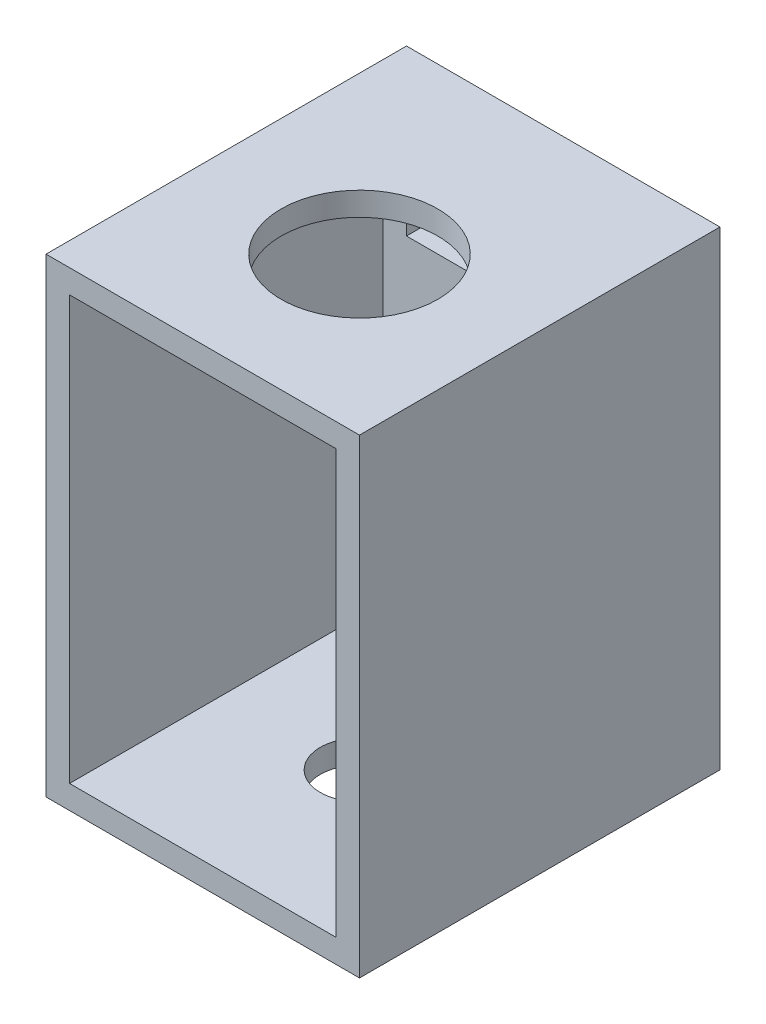
ISO-10303-21;
HEADER;
FILE_DESCRIPTION(('STEP AP214'),'2;1');
FILE_NAME('part.step','',(''),(''),'','','');
FILE_SCHEMA(('AUTOMOTIVE_DESIGN { 1 0 10303 214 1 1 1 1 }'));
ENDSEC;
DATA;
#1=APPLICATION_CONTEXT('core data for automotive mechanical design processes');
#2=APPLICATION_PROTOCOL_DEFINITION('international standard','automotive_design',2000,#1);
#3=PRODUCT_CONTEXT('',#1,'mechanical');
#4=PRODUCT('Part','Part','',(#3));
#5=PRODUCT_RELATED_PRODUCT_CATEGORY('part','',(#4));
#6=PRODUCT_DEFINITION_FORMATION('','',#4);
#7=PRODUCT_DEFINITION_CONTEXT('part definition',#1,'design');
#8=PRODUCT_DEFINITION('design','',#6,#7);
#9=PRODUCT_DEFINITION_SHAPE('','',#8);
#10=(LENGTH_UNIT() NAMED_UNIT(*) SI_UNIT(.MILLI.,.METRE.));
#11=(NAMED_UNIT(*) PLANE_ANGLE_UNIT() SI_UNIT($,.RADIAN.));
#12=(NAMED_UNIT(*) SI_UNIT($,.STERADIAN.) SOLID_ANGLE_UNIT());
#13=UNCERTAINTY_MEASURE_WITH_UNIT(LENGTH_MEASURE(1.E-05),#10,'distance_accuracy_value','');
#14=(GEOMETRIC_REPRESENTATION_CONTEXT(3) GLOBAL_UNCERTAINTY_ASSIGNED_CONTEXT((#13)) GLOBAL_UNIT_ASSIGNED_CONTEXT((#10,
#11,#12)) REPRESENTATION_CONTEXT('',''));
#15=CARTESIAN_POINT('',(0.,0.,0.));
#16=DIRECTION('',(0.,0.,1.));
#17=DIRECTION('',(1.,0.,0.));
#18=AXIS2_PLACEMENT_3D('',#15,#16,#17);
#19=CARTESIAN_POINT('',(0.,50.,-3.));
#20=DIRECTION('',(0.,-1.,0.));
#21=DIRECTION('',(0.,0.,-1.));
#22=AXIS2_PLACEMENT_3D('',#19,#20,#21);
#23=PLANE('',#22);
#24=DIRECTION('',(0.,0.,1.));
#25=VECTOR('',#24,1.);
#26=CARTESIAN_POINT('',(0.,50.,-3.));
#27=LINE('',#26,#25);
#28=CARTESIAN_POINT('',(0.,50.,-3.));
#29=VERTEX_POINT('',#28);
#30=CARTESIAN_POINT('',(0.,50.,20.));
#31=VERTEX_POINT('',#30);
#32=EDGE_CURVE('E146',#29,#31,#27,.T.);
#33=ORIENTED_EDGE('',*,*,#32,.T.);
#34=DIRECTION('',(1.,0.,0.));
#35=VECTOR('',#34,1.);
#36=CARTESIAN_POINT('',(0.,50.,20.));
#37=LINE('',#36,#35);
#38=CARTESIAN_POINT('',(20.,50.,20.));
#39=VERTEX_POINT('',#38);
#40=EDGE_CURVE('E155',#31,#39,#37,.T.);
#41=ORIENTED_EDGE('',*,*,#40,.T.);
#42=DIRECTION('',(0.,0.,1.));
#43=VECTOR('',#42,1.);
#44=CARTESIAN_POINT('',(20.,50.,-3.));
#45=LINE('',#44,#43);
#46=CARTESIAN_POINT('',(20.,50.,-3.));
#47=VERTEX_POINT('',#46);
#48=EDGE_CURVE('E136',#47,#39,#45,.T.);
#49=ORIENTED_EDGE('',*,*,#48,.F.);
#50=DIRECTION('',(1.,0.,0.));
#51=VECTOR('',#50,1.);
#52=CARTESIAN_POINT('',(0.,50.,-3.));
#53=LINE('',#52,#51);
#54=EDGE_CURVE('E244',#29,#47,#53,.T.);
#55=ORIENTED_EDGE('',*,*,#54,.F.);
#56=EDGE_LOOP('',(#33,#41,#49,#55));
#57=FACE_BOUND('',#56,.T.);
#58=CARTESIAN_POINT('',(9.99999999999999,50.,10.));
#59=DIRECTION('',(0.,1.,0.));
#60=DIRECTION('',(0.,0.,1.));
#61=AXIS2_PLACEMENT_3D('',#58,#59,#60);
#62=CIRCLE('',#61,5.);
#63=CARTESIAN_POINT('',(15.,50.,10.));
#64=VERTEX_POINT('',#63);
#65=EDGE_CURVE('E377',#64,#64,#62,.T.);
#66=ORIENTED_EDGE('',*,*,#65,.F.);
#67=EDGE_LOOP('',(#66));
#68=FACE_BOUND('',#67,.T.);
#69=ADVANCED_FACE('F45',(#57,#68),#23,.F.);
#70=CARTESIAN_POINT('',(0.,48.5,20.));
#71=DIRECTION('',(0.,1.,0.));
#72=DIRECTION('',(0.,0.,1.));
#73=AXIS2_PLACEMENT_3D('',#70,#71,#72);
#74=PLANE('',#73);
#75=DIRECTION('',(1.,0.,0.));
#76=VECTOR('',#75,1.);
#77=CARTESIAN_POINT('',(0.,48.5,0.));
#78=LINE('',#77,#76);
#79=CARTESIAN_POINT('',(1.5,48.5,0.));
#80=VERTEX_POINT('',#79);
#81=CARTESIAN_POINT('',(18.5,48.5,0.));
#82=VERTEX_POINT('',#81);
#83=EDGE_CURVE('E190',#80,#82,#78,.T.);
#84=ORIENTED_EDGE('',*,*,#83,.T.);
#85=DIRECTION('',(0.,0.,-1.));
#86=VECTOR('',#85,1.);
#87=CARTESIAN_POINT('',(18.5,48.5,20.));
#88=LINE('',#87,#86);
#89=CARTESIAN_POINT('',(18.5,48.5,20.));
#90=VERTEX_POINT('',#89);
#91=EDGE_CURVE('E210',#90,#82,#88,.T.);
#92=ORIENTED_EDGE('',*,*,#91,.F.);
#93=DIRECTION('',(1.,0.,0.));
#94=VECTOR('',#93,1.);
#95=CARTESIAN_POINT('',(0.,48.5,20.));
#96=LINE('',#95,#94);
#97=CARTESIAN_POINT('',(1.5,48.5,20.));
#98=VERTEX_POINT('',#97);
#99=EDGE_CURVE('E174',#98,#90,#96,.T.);
#100=ORIENTED_EDGE('',*,*,#99,.F.);
#101=DIRECTION('',(0.,0.,-1.));
#102=VECTOR('',#101,1.);
#103=CARTESIAN_POINT('',(1.5,48.5,20.));
#104=LINE('',#103,#102);
#105=EDGE_CURVE('E189',#98,#80,#104,.T.);
#106=ORIENTED_EDGE('',*,*,#105,.T.);
#107=EDGE_LOOP('',(#84,#92,#100,#106));
#108=FACE_BOUND('',#107,.T.);
#109=CARTESIAN_POINT('',(9.99999999999999,48.5,10.));
#110=DIRECTION('',(0.,1.,0.));
#111=DIRECTION('',(0.,0.,1.));
#112=AXIS2_PLACEMENT_3D('',#109,#110,#111);
#113=CIRCLE('',#112,5.);
#114=CARTESIAN_POINT('',(15.,48.5,10.));
#115=VERTEX_POINT('',#114);
#116=EDGE_CURVE('E380',#115,#115,#113,.T.);
#117=ORIENTED_EDGE('',*,*,#116,.T.);
#118=EDGE_LOOP('',(#117));
#119=FACE_BOUND('',#118,.T.);
#120=ADVANCED_FACE('F326',(#108,#119),#74,.F.);
#121=CARTESIAN_POINT('',(0.,0.,0.));
#122=DIRECTION('',(0.,0.,1.));
#123=DIRECTION('',(1.,0.,0.));
#124=AXIS2_PLACEMENT_3D('',#121,#122,#123);
#125=PLANE('',#124);
#126=DIRECTION('',(1.,0.,0.));
#127=VECTOR('',#126,1.);
#128=CARTESIAN_POINT('',(0.,47.,0.));
#129=LINE('',#128,#127);
#130=CARTESIAN_POINT('',(3.,47.,0.));
#131=VERTEX_POINT('',#130);
#132=CARTESIAN_POINT('',(11.,47.,0.));
#133=VERTEX_POINT('',#132);
#134=EDGE_CURVE('E267',#131,#133,#129,.T.);
#135=ORIENTED_EDGE('',*,*,#134,.T.);
#136=DIRECTION('',(0.,-1.,0.));
#137=VECTOR('',#136,1.);
#138=CARTESIAN_POINT('',(11.,0.,0.));
#139=LINE('',#138,#137);
#140=CARTESIAN_POINT('',(11.,42.5,0.));
#141=VERTEX_POINT('',#140);
#142=EDGE_CURVE('E271',#133,#141,#139,.T.);
#143=ORIENTED_EDGE('',*,*,#142,.T.);
#144=DIRECTION('',(1.,0.,0.));
#145=VECTOR('',#144,1.);
#146=CARTESIAN_POINT('',(0.,42.5,0.));
#147=LINE('',#146,#145);
#148=CARTESIAN_POINT('',(3.,42.5,0.));
#149=VERTEX_POINT('',#148);
#150=EDGE_CURVE('E275',#149,#141,#147,.T.);
#151=ORIENTED_EDGE('',*,*,#150,.F.);
#152=DIRECTION('',(0.,-1.,0.));
#153=VECTOR('',#152,1.);
#154=CARTESIAN_POINT('',(3.00000000000001,0.,0.));
#155=LINE('',#154,#153);
#156=EDGE_CURVE('E219',#131,#149,#155,.T.);
#157=ORIENTED_EDGE('',*,*,#156,.F.);
#158=EDGE_LOOP('',(#135,#143,#151,#157));
#159=FACE_BOUND('',#158,.T.);
#160=CARTESIAN_POINT('',(15.25,25.,0.));
#161=DIRECTION('',(0.,0.,1.));
#162=DIRECTION('',(1.,0.,0.));
#163=AXIS2_PLACEMENT_3D('',#160,#161,#162);
#164=CIRCLE('',#163,1.75);
#165=CARTESIAN_POINT('',(17.,25.,0.));
#166=VERTEX_POINT('',#165);
#167=EDGE_CURVE('E263',#166,#166,#164,.T.);
#168=ORIENTED_EDGE('',*,*,#167,.F.);
#169=EDGE_LOOP('',(#168));
#170=FACE_BOUND('',#169,.T.);
#171=CARTESIAN_POINT('',(14.75,44.75,0.));
#172=DIRECTION('',(0.,0.,1.));
#173=DIRECTION('',(1.,0.,0.));
#174=AXIS2_PLACEMENT_3D('',#171,#172,#173);
#175=CIRCLE('',#174,2.25);
#176=CARTESIAN_POINT('',(17.,44.75,0.));
#177=VERTEX_POINT('',#176);
#178=EDGE_CURVE('E259',#177,#177,#175,.T.);
#179=ORIENTED_EDGE('',*,*,#178,.F.);
#180=EDGE_LOOP('',(#179));
#181=FACE_BOUND('',#180,.T.);
#182=CARTESIAN_POINT('',(10.,35.,0.));
#183=DIRECTION('',(0.,0.,1.));
#184=DIRECTION('',(1.,0.,0.));
#185=AXIS2_PLACEMENT_3D('',#182,#183,#184);
#186=CIRCLE('',#185,7.);
#187=CARTESIAN_POINT('',(17.,35.,0.));
#188=VERTEX_POINT('',#187);
#189=EDGE_CURVE('E213',#188,#188,#186,.T.);
#190=ORIENTED_EDGE('',*,*,#189,.F.);
#191=EDGE_LOOP('',(#190));
#192=FACE_BOUND('',#191,.T.);
#193=DIRECTION('',(0.,-1.,0.));
#194=VECTOR('',#193,1.);
#195=CARTESIAN_POINT('',(18.5,0.,0.));
#196=LINE('',#195,#194);
#197=CARTESIAN_POINT('',(18.5,21.5,0.));
#198=VERTEX_POINT('',#197);
#199=EDGE_CURVE('E63',#82,#198,#196,.T.);
#200=ORIENTED_EDGE('',*,*,#199,.F.);
#201=ORIENTED_EDGE('',*,*,#83,.F.);
#202=DIRECTION('',(0.,-1.,0.));
#203=VECTOR('',#202,1.);
#204=CARTESIAN_POINT('',(1.5,0.,0.));
#205=LINE('',#204,#203);
#206=CARTESIAN_POINT('',(1.5,21.5,0.));
#207=VERTEX_POINT('',#206);
#208=EDGE_CURVE('E159',#80,#207,#205,.T.);
#209=ORIENTED_EDGE('',*,*,#208,.T.);
#210=DIRECTION('',(1.,0.,0.));
#211=VECTOR('',#210,1.);
#212=CARTESIAN_POINT('',(0.,21.5,0.));
#213=LINE('',#212,#211);
#214=EDGE_CURVE('E68',#207,#198,#213,.T.);
#215=ORIENTED_EDGE('',*,*,#214,.T.);
#216=EDGE_LOOP('',(#200,#201,#209,#215));
#217=FACE_BOUND('',#216,.T.);
#218=ADVANCED_FACE('F305',(#159,#170,#181,#192,#217),#125,.T.);
#219=CARTESIAN_POINT('',(20.,0.,-3.));
#220=DIRECTION('',(-1.,0.,0.));
#221=DIRECTION('',(0.,-1.,0.));
#222=AXIS2_PLACEMENT_3D('',#219,#220,#221);
#223=PLANE('',#222);
#224=ORIENTED_EDGE('',*,*,#48,.T.);
#225=DIRECTION('',(0.,-1.,0.));
#226=VECTOR('',#225,1.);
#227=CARTESIAN_POINT('',(20.,0.,20.));
#228=LINE('',#227,#226);
#229=CARTESIAN_POINT('',(20.,20.,20.));
#230=VERTEX_POINT('',#229);
#231=EDGE_CURVE('E140',#39,#230,#228,.T.);
#232=ORIENTED_EDGE('',*,*,#231,.T.);
#233=DIRECTION('',(0.,0.,1.));
#234=VECTOR('',#233,1.);
#235=CARTESIAN_POINT('',(20.,20.,-3.));
#236=LINE('',#235,#234);
#237=CARTESIAN_POINT('',(20.,20.,-3.));
#238=VERTEX_POINT('',#237);
#239=EDGE_CURVE('E12',#238,#230,#236,.T.);
#240=ORIENTED_EDGE('',*,*,#239,.F.);
#241=DIRECTION('',(0.,-1.,0.));
#242=VECTOR('',#241,1.);
#243=CARTESIAN_POINT('',(20.,0.,-3.));
#244=LINE('',#243,#242);
#245=EDGE_CURVE('E141',#47,#238,#244,.T.);
#246=ORIENTED_EDGE('',*,*,#245,.F.);
#247=EDGE_LOOP('',(#224,#232,#240,#246));
#248=FACE_BOUND('',#247,.T.);
#249=ADVANCED_FACE('F138',(#248),#223,.F.);
#250=CARTESIAN_POINT('',(0.,20.,-3.));
#251=DIRECTION('',(0.,-1.,0.));
#252=DIRECTION('',(1.,0.,0.));
#253=AXIS2_PLACEMENT_3D('',#250,#251,#252);
#254=PLANE('',#253);
#255=CARTESIAN_POINT('',(10.,20.,10.));
#256=DIRECTION('',(0.,-1.,0.));
#257=DIRECTION('',(1.,0.,0.));
#258=AXIS2_PLACEMENT_3D('',#255,#256,#257);
#259=CIRCLE('',#258,2.5);
#260=CARTESIAN_POINT('',(12.5,20.,10.));
#261=VERTEX_POINT('',#260);
#262=EDGE_CURVE('E385',#261,#261,#259,.T.);
#263=ORIENTED_EDGE('',*,*,#262,.F.);
#264=EDGE_LOOP('',(#263));
#265=FACE_BOUND('',#264,.T.);
#266=ORIENTED_EDGE('',*,*,#239,.T.);
#267=DIRECTION('',(1.,0.,0.));
#268=VECTOR('',#267,1.);
#269=CARTESIAN_POINT('',(0.,20.,20.));
#270=LINE('',#269,#268);
#271=CARTESIAN_POINT('',(0.,20.,20.));
#272=VERTEX_POINT('',#271);
#273=EDGE_CURVE('E157',#272,#230,#270,.T.);
#274=ORIENTED_EDGE('',*,*,#273,.F.);
#275=DIRECTION('',(0.,0.,1.));
#276=VECTOR('',#275,1.);
#277=CARTESIAN_POINT('',(0.,20.,-3.));
#278=LINE('',#277,#276);
#279=CARTESIAN_POINT('',(0.,20.,-3.));
#280=VERTEX_POINT('',#279);
#281=EDGE_CURVE('E55',#280,#272,#278,.T.);
#282=ORIENTED_EDGE('',*,*,#281,.F.);
#283=DIRECTION('',(1.,0.,0.));
#284=VECTOR('',#283,1.);
#285=CARTESIAN_POINT('',(0.,20.,-3.));
#286=LINE('',#285,#284);
#287=EDGE_CURVE('E251',#280,#238,#286,.T.);
#288=ORIENTED_EDGE('',*,*,#287,.T.);
#289=EDGE_LOOP('',(#266,#274,#282,#288));
#290=FACE_BOUND('',#289,.T.);
#291=ADVANCED_FACE('F338',(#265,#290),#254,.T.);
#292=CARTESIAN_POINT('',(0.,0.,-3.));
#293=DIRECTION('',(-1.,0.,0.));
#294=DIRECTION('',(0.,-1.,0.));
#295=AXIS2_PLACEMENT_3D('',#292,#293,#294);
#296=PLANE('',#295);
#297=ORIENTED_EDGE('',*,*,#281,.T.);
#298=DIRECTION('',(0.,-1.,0.));
#299=VECTOR('',#298,1.);
#300=CARTESIAN_POINT('',(0.,0.,20.));
#301=LINE('',#300,#299);
#302=EDGE_CURVE('E164',#31,#272,#301,.T.);
#303=ORIENTED_EDGE('',*,*,#302,.F.);
#304=ORIENTED_EDGE('',*,*,#32,.F.);
#305=DIRECTION('',(0.,-1.,0.));
#306=VECTOR('',#305,1.);
#307=CARTESIAN_POINT('',(0.,0.,-3.));
#308=LINE('',#307,#306);
#309=EDGE_CURVE('E247',#29,#280,#308,.T.);
#310=ORIENTED_EDGE('',*,*,#309,.T.);
#311=EDGE_LOOP('',(#297,#303,#304,#310));
#312=FACE_BOUND('',#311,.T.);
#313=ADVANCED_FACE('F335',(#312),#296,.T.);
#314=CARTESIAN_POINT('',(0.,47.,-3.));
#315=DIRECTION('',(0.,-1.,0.));
#316=DIRECTION('',(0.,0.,-1.));
#317=AXIS2_PLACEMENT_3D('',#314,#315,#316);
#318=PLANE('',#317);
#319=ORIENTED_EDGE('',*,*,#134,.F.);
#320=DIRECTION('',(0.,0.,1.));
#321=VECTOR('',#320,1.);
#322=CARTESIAN_POINT('',(3.,47.,-3.));
#323=LINE('',#322,#321);
#324=CARTESIAN_POINT('',(3.,47.,-3.));
#325=VERTEX_POINT('',#324);
#326=EDGE_CURVE('E147',#325,#131,#323,.T.);
#327=ORIENTED_EDGE('',*,*,#326,.F.);
#328=DIRECTION('',(1.,0.,0.));
#329=VECTOR('',#328,1.);
#330=CARTESIAN_POINT('',(0.,47.,-3.));
#331=LINE('',#330,#329);
#332=CARTESIAN_POINT('',(11.,47.,-3.));
#333=VERTEX_POINT('',#332);
#334=EDGE_CURVE('E227',#325,#333,#331,.T.);
#335=ORIENTED_EDGE('',*,*,#334,.T.);
#336=DIRECTION('',(0.,0.,1.));
#337=VECTOR('',#336,1.);
#338=CARTESIAN_POINT('',(11.,47.,-3.));
#339=LINE('',#338,#337);
#340=EDGE_CURVE('E255',#333,#133,#339,.T.);
#341=ORIENTED_EDGE('',*,*,#340,.T.);
#342=EDGE_LOOP('',(#319,#327,#335,#341));
#343=FACE_BOUND('',#342,.T.);
#344=ADVANCED_FACE('F297',(#343),#318,.T.);
#345=CARTESIAN_POINT('',(3.00000000000001,0.,-3.));
#346=DIRECTION('',(-1.,0.,0.));
#347=DIRECTION('',(0.,-1.,0.));
#348=AXIS2_PLACEMENT_3D('',#345,#346,#347);
#349=PLANE('',#348);
#350=ORIENTED_EDGE('',*,*,#156,.T.);
#351=DIRECTION('',(0.,0.,1.));
#352=VECTOR('',#351,1.);
#353=CARTESIAN_POINT('',(3.,42.5,-3.));
#354=LINE('',#353,#352);
#355=CARTESIAN_POINT('',(3.,42.5,-3.));
#356=VERTEX_POINT('',#355);
#357=EDGE_CURVE('E288',#356,#149,#354,.T.);
#358=ORIENTED_EDGE('',*,*,#357,.F.);
#359=DIRECTION('',(0.,-1.,0.));
#360=VECTOR('',#359,1.);
#361=CARTESIAN_POINT('',(3.00000000000001,0.,-3.));
#362=LINE('',#361,#360);
#363=EDGE_CURVE('E238',#325,#356,#362,.T.);
#364=ORIENTED_EDGE('',*,*,#363,.F.);
#365=ORIENTED_EDGE('',*,*,#326,.T.);
#366=EDGE_LOOP('',(#350,#358,#364,#365));
#367=FACE_BOUND('',#366,.T.);
#368=ADVANCED_FACE('F309',(#367),#349,.F.);
#369=CARTESIAN_POINT('',(0.,42.5,-3.));
#370=DIRECTION('',(0.,-1.,0.));
#371=DIRECTION('',(1.,0.,0.));
#372=AXIS2_PLACEMENT_3D('',#369,#370,#371);
#373=PLANE('',#372);
#374=ORIENTED_EDGE('',*,*,#150,.T.);
#375=DIRECTION('',(0.,0.,1.));
#376=VECTOR('',#375,1.);
#377=CARTESIAN_POINT('',(11.,42.5,-3.));
#378=LINE('',#377,#376);
#379=CARTESIAN_POINT('',(11.,42.5,-3.));
#380=VERTEX_POINT('',#379);
#381=EDGE_CURVE('E291',#380,#141,#378,.T.);
#382=ORIENTED_EDGE('',*,*,#381,.F.);
#383=DIRECTION('',(1.,0.,0.));
#384=VECTOR('',#383,1.);
#385=CARTESIAN_POINT('',(0.,42.5,-3.));
#386=LINE('',#385,#384);
#387=EDGE_CURVE('E235',#356,#380,#386,.T.);
#388=ORIENTED_EDGE('',*,*,#387,.F.);
#389=ORIENTED_EDGE('',*,*,#357,.T.);
#390=EDGE_LOOP('',(#374,#382,#388,#389));
#391=FACE_BOUND('',#390,.T.);
#392=ADVANCED_FACE('F315',(#391),#373,.F.);
#393=CARTESIAN_POINT('',(11.,0.,-3.));
#394=DIRECTION('',(-1.,0.,0.));
#395=DIRECTION('',(0.,0.,1.));
#396=AXIS2_PLACEMENT_3D('',#393,#394,#395);
#397=PLANE('',#396);
#398=ORIENTED_EDGE('',*,*,#142,.F.);
#399=ORIENTED_EDGE('',*,*,#340,.F.);
#400=DIRECTION('',(0.,-1.,0.));
#401=VECTOR('',#400,1.);
#402=CARTESIAN_POINT('',(11.,0.,-3.));
#403=LINE('',#402,#401);
#404=EDGE_CURVE('E231',#333,#380,#403,.T.);
#405=ORIENTED_EDGE('',*,*,#404,.T.);
#406=ORIENTED_EDGE('',*,*,#381,.T.);
#407=EDGE_LOOP('',(#398,#399,#405,#406));
#408=FACE_BOUND('',#407,.T.);
#409=ADVANCED_FACE('F301',(#408),#397,.T.);
#410=CARTESIAN_POINT('',(15.25,25.,-3.));
#411=DIRECTION('',(0.,0.,1.));
#412=DIRECTION('',(1.,0.,0.));
#413=AXIS2_PLACEMENT_3D('',#410,#411,#412);
#414=CYLINDRICAL_SURFACE('',#413,1.75);
#415=CARTESIAN_POINT('',(15.25,25.,-3.));
#416=DIRECTION('',(0.,0.,1.));
#417=DIRECTION('',(1.,0.,0.));
#418=AXIS2_PLACEMENT_3D('',#415,#416,#417);
#419=CIRCLE('',#418,1.75);
#420=CARTESIAN_POINT('',(17.,25.,-3.));
#421=VERTEX_POINT('',#420);
#422=EDGE_CURVE('E223',#421,#421,#419,.T.);
#423=ORIENTED_EDGE('',*,*,#422,.F.);
#424=EDGE_LOOP('',(#423));
#425=FACE_BOUND('',#424,.T.);
#426=ORIENTED_EDGE('',*,*,#167,.T.);
#427=EDGE_LOOP('',(#426));
#428=FACE_BOUND('',#427,.T.);
#429=ADVANCED_FACE('F322',(#425,#428),#414,.F.);
#430=CARTESIAN_POINT('',(14.75,44.75,-3.));
#431=DIRECTION('',(0.,0.,1.));
#432=DIRECTION('',(1.,0.,0.));
#433=AXIS2_PLACEMENT_3D('',#430,#431,#432);
#434=CYLINDRICAL_SURFACE('',#433,2.25);
#435=CARTESIAN_POINT('',(14.75,44.75,-3.));
#436=DIRECTION('',(0.,0.,1.));
#437=DIRECTION('',(1.,0.,0.));
#438=AXIS2_PLACEMENT_3D('',#435,#436,#437);
#439=CIRCLE('',#438,2.25);
#440=CARTESIAN_POINT('',(17.,44.75,-3.));
#441=VERTEX_POINT('',#440);
#442=EDGE_CURVE('E218',#441,#441,#439,.T.);
#443=ORIENTED_EDGE('',*,*,#442,.F.);
#444=EDGE_LOOP('',(#443));
#445=FACE_BOUND('',#444,.T.);
#446=ORIENTED_EDGE('',*,*,#178,.T.);
#447=EDGE_LOOP('',(#446));
#448=FACE_BOUND('',#447,.T.);
#449=ADVANCED_FACE('F413',(#445,#448),#434,.F.);
#450=CARTESIAN_POINT('',(10.,35.,-3.));
#451=DIRECTION('',(0.,0.,1.));
#452=DIRECTION('',(1.,0.,0.));
#453=AXIS2_PLACEMENT_3D('',#450,#451,#452);
#454=CYLINDRICAL_SURFACE('',#453,7.);
#455=CARTESIAN_POINT('',(10.,35.,-3.));
#456=DIRECTION('',(0.,0.,1.));
#457=DIRECTION('',(1.,0.,0.));
#458=AXIS2_PLACEMENT_3D('',#455,#456,#457);
#459=CIRCLE('',#458,7.);
#460=CARTESIAN_POINT('',(17.,35.,-3.));
#461=VERTEX_POINT('',#460);
#462=EDGE_CURVE('E214',#461,#461,#459,.T.);
#463=ORIENTED_EDGE('',*,*,#462,.F.);
#464=EDGE_LOOP('',(#463));
#465=FACE_BOUND('',#464,.T.);
#466=ORIENTED_EDGE('',*,*,#189,.T.);
#467=EDGE_LOOP('',(#466));
#468=FACE_BOUND('',#467,.T.);
#469=ADVANCED_FACE('F47',(#465,#468),#454,.F.);
#470=CARTESIAN_POINT('',(0.,0.,-3.));
#471=DIRECTION('',(0.,0.,1.));
#472=DIRECTION('',(1.,0.,0.));
#473=AXIS2_PLACEMENT_3D('',#470,#471,#472);
#474=PLANE('',#473);
#475=ORIENTED_EDGE('',*,*,#462,.T.);
#476=EDGE_LOOP('',(#475));
#477=FACE_BOUND('',#476,.T.);
#478=ORIENTED_EDGE('',*,*,#442,.T.);
#479=EDGE_LOOP('',(#478));
#480=FACE_BOUND('',#479,.T.);
#481=ORIENTED_EDGE('',*,*,#422,.T.);
#482=EDGE_LOOP('',(#481));
#483=FACE_BOUND('',#482,.T.);
#484=ORIENTED_EDGE('',*,*,#334,.F.);
#485=ORIENTED_EDGE('',*,*,#363,.T.);
#486=ORIENTED_EDGE('',*,*,#387,.T.);
#487=ORIENTED_EDGE('',*,*,#404,.F.);
#488=EDGE_LOOP('',(#484,#485,#486,#487));
#489=FACE_BOUND('',#488,.T.);
#490=ORIENTED_EDGE('',*,*,#245,.T.);
#491=ORIENTED_EDGE('',*,*,#287,.F.);
#492=ORIENTED_EDGE('',*,*,#309,.F.);
#493=ORIENTED_EDGE('',*,*,#54,.T.);
#494=EDGE_LOOP('',(#490,#491,#492,#493));
#495=FACE_BOUND('',#494,.T.);
#496=ADVANCED_FACE('F312',(#477,#480,#483,#489,#495),#474,.F.);
#497=CARTESIAN_POINT('',(18.5,0.,20.));
#498=DIRECTION('',(1.,0.,0.));
#499=DIRECTION('',(0.,1.,0.));
#500=AXIS2_PLACEMENT_3D('',#497,#498,#499);
#501=PLANE('',#500);
#502=ORIENTED_EDGE('',*,*,#199,.T.);
#503=DIRECTION('',(0.,0.,-1.));
#504=VECTOR('',#503,1.);
#505=CARTESIAN_POINT('',(18.5,21.5,20.));
#506=LINE('',#505,#504);
#507=CARTESIAN_POINT('',(18.5,21.5,20.));
#508=VERTEX_POINT('',#507);
#509=EDGE_CURVE('E207',#508,#198,#506,.T.);
#510=ORIENTED_EDGE('',*,*,#509,.F.);
#511=DIRECTION('',(0.,-1.,0.));
#512=VECTOR('',#511,1.);
#513=CARTESIAN_POINT('',(18.5,0.,20.));
#514=LINE('',#513,#512);
#515=EDGE_CURVE('E178',#90,#508,#514,.T.);
#516=ORIENTED_EDGE('',*,*,#515,.F.);
#517=ORIENTED_EDGE('',*,*,#91,.T.);
#518=EDGE_LOOP('',(#502,#510,#516,#517));
#519=FACE_BOUND('',#518,.T.);
#520=ADVANCED_FACE('F349',(#519),#501,.F.);
#521=CARTESIAN_POINT('',(0.,21.5,20.));
#522=DIRECTION('',(0.,1.,0.));
#523=DIRECTION('',(-1.,0.,0.));
#524=AXIS2_PLACEMENT_3D('',#521,#522,#523);
#525=PLANE('',#524);
#526=CARTESIAN_POINT('',(10.,21.5,10.));
#527=DIRECTION('',(0.,1.,0.));
#528=DIRECTION('',(-1.,0.,0.));
#529=AXIS2_PLACEMENT_3D('',#526,#527,#528);
#530=CIRCLE('',#529,2.5);
#531=CARTESIAN_POINT('',(12.5,21.5,10.));
#532=VERTEX_POINT('',#531);
#533=EDGE_CURVE('E49',#532,#532,#530,.T.);
#534=ORIENTED_EDGE('',*,*,#533,.F.);
#535=EDGE_LOOP('',(#534));
#536=FACE_BOUND('',#535,.T.);
#537=ORIENTED_EDGE('',*,*,#214,.F.);
#538=DIRECTION('',(0.,0.,-1.));
#539=VECTOR('',#538,1.);
#540=CARTESIAN_POINT('',(1.5,21.5,20.));
#541=LINE('',#540,#539);
#542=CARTESIAN_POINT('',(1.5,21.5,20.));
#543=VERTEX_POINT('',#542);
#544=EDGE_CURVE('E203',#543,#207,#541,.T.);
#545=ORIENTED_EDGE('',*,*,#544,.F.);
#546=DIRECTION('',(1.,0.,0.));
#547=VECTOR('',#546,1.);
#548=CARTESIAN_POINT('',(0.,21.5,20.));
#549=LINE('',#548,#547);
#550=EDGE_CURVE('E181',#543,#508,#549,.T.);
#551=ORIENTED_EDGE('',*,*,#550,.T.);
#552=ORIENTED_EDGE('',*,*,#509,.T.);
#553=EDGE_LOOP('',(#537,#545,#551,#552));
#554=FACE_BOUND('',#553,.T.);
#555=ADVANCED_FACE('F354',(#536,#554),#525,.T.);
#556=CARTESIAN_POINT('',(1.5,0.,20.));
#557=DIRECTION('',(1.,0.,0.));
#558=DIRECTION('',(0.,0.,-1.));
#559=AXIS2_PLACEMENT_3D('',#556,#557,#558);
#560=PLANE('',#559);
#561=ORIENTED_EDGE('',*,*,#208,.F.);
#562=ORIENTED_EDGE('',*,*,#105,.F.);
#563=DIRECTION('',(0.,-1.,0.));
#564=VECTOR('',#563,1.);
#565=CARTESIAN_POINT('',(1.5,0.,20.));
#566=LINE('',#565,#564);
#567=EDGE_CURVE('E185',#98,#543,#566,.T.);
#568=ORIENTED_EDGE('',*,*,#567,.T.);
#569=ORIENTED_EDGE('',*,*,#544,.T.);
#570=EDGE_LOOP('',(#561,#562,#568,#569));
#571=FACE_BOUND('',#570,.T.);
#572=ADVANCED_FACE('F358',(#571),#560,.T.);
#573=CARTESIAN_POINT('',(0.,0.,20.));
#574=DIRECTION('',(0.,0.,1.));
#575=DIRECTION('',(1.,0.,0.));
#576=AXIS2_PLACEMENT_3D('',#573,#574,#575);
#577=PLANE('',#576);
#578=ORIENTED_EDGE('',*,*,#231,.F.);
#579=ORIENTED_EDGE('',*,*,#40,.F.);
#580=ORIENTED_EDGE('',*,*,#302,.T.);
#581=ORIENTED_EDGE('',*,*,#273,.T.);
#582=EDGE_LOOP('',(#578,#579,#580,#581));
#583=FACE_BOUND('',#582,.T.);
#584=ORIENTED_EDGE('',*,*,#99,.T.);
#585=ORIENTED_EDGE('',*,*,#515,.T.);
#586=ORIENTED_EDGE('',*,*,#550,.F.);
#587=ORIENTED_EDGE('',*,*,#567,.F.);
#588=EDGE_LOOP('',(#584,#585,#586,#587));
#589=FACE_BOUND('',#588,.T.);
#590=ADVANCED_FACE('F152',(#583,#589),#577,.T.);
#591=CARTESIAN_POINT('',(9.99999999999999,50.,10.));
#592=DIRECTION('',(0.,-1.,0.));
#593=DIRECTION('',(1.,0.,0.));
#594=AXIS2_PLACEMENT_3D('',#591,#592,#593);
#595=CYLINDRICAL_SURFACE('',#594,2.5);
#596=CARTESIAN_POINT('',(12.5,21.5,10.));
#597=CARTESIAN_POINT('',(12.5,21.484375,10.));
#598=CARTESIAN_POINT('',(12.5,21.46875,10.));
#599=CARTESIAN_POINT('',(12.5,21.4375,10.));
#600=CARTESIAN_POINT('',(12.5,21.421875,10.));
#601=CARTESIAN_POINT('',(12.5,21.390625,10.));
#602=CARTESIAN_POINT('',(12.5,21.375,10.));
#603=CARTESIAN_POINT('',(12.5,21.34375,10.));
#604=CARTESIAN_POINT('',(12.5,21.328125,10.));
#605=CARTESIAN_POINT('',(12.5,21.296875,10.));
#606=CARTESIAN_POINT('',(12.5,21.28125,10.));
#607=CARTESIAN_POINT('',(12.5,21.25,10.));
#608=CARTESIAN_POINT('',(12.5,21.234375,10.));
#609=CARTESIAN_POINT('',(12.5,21.203125,10.));
#610=CARTESIAN_POINT('',(12.5,21.1875,10.));
#611=CARTESIAN_POINT('',(12.5,21.15625,10.));
#612=CARTESIAN_POINT('',(12.5,21.140625,10.));
#613=CARTESIAN_POINT('',(12.5,21.109375,10.));
#614=CARTESIAN_POINT('',(12.5,21.09375,10.));
#615=CARTESIAN_POINT('',(12.5,21.0625,10.));
#616=CARTESIAN_POINT('',(12.5,21.046875,10.));
#617=CARTESIAN_POINT('',(12.5,21.015625,10.));
#618=CARTESIAN_POINT('',(12.5,21.,10.));
#619=CARTESIAN_POINT('',(12.5,20.96875,10.));
#620=CARTESIAN_POINT('',(12.5,20.953125,10.));
#621=CARTESIAN_POINT('',(12.5,20.921875,10.));
#622=CARTESIAN_POINT('',(12.5,20.90625,10.));
#623=CARTESIAN_POINT('',(12.5,20.875,10.));
#624=CARTESIAN_POINT('',(12.5,20.859375,10.));
#625=CARTESIAN_POINT('',(12.5,20.828125,10.));
#626=CARTESIAN_POINT('',(12.5,20.8125,10.));
#627=CARTESIAN_POINT('',(12.5,20.78125,10.));
#628=CARTESIAN_POINT('',(12.5,20.765625,10.));
#629=CARTESIAN_POINT('',(12.5,20.734375,10.));
#630=CARTESIAN_POINT('',(12.5,20.71875,10.));
#631=CARTESIAN_POINT('',(12.5,20.6875,10.));
#632=CARTESIAN_POINT('',(12.5,20.671875,10.));
#633=CARTESIAN_POINT('',(12.5,20.640625,10.));
#634=CARTESIAN_POINT('',(12.5,20.625,10.));
#635=CARTESIAN_POINT('',(12.5,20.59375,10.));
#636=CARTESIAN_POINT('',(12.5,20.578125,10.));
#637=CARTESIAN_POINT('',(12.5,20.546875,10.));
#638=CARTESIAN_POINT('',(12.5,20.53125,10.));
#639=CARTESIAN_POINT('',(12.5,20.5,10.));
#640=CARTESIAN_POINT('',(12.5,20.484375,10.));
#641=CARTESIAN_POINT('',(12.5,20.453125,10.));
#642=CARTESIAN_POINT('',(12.5,20.4375,10.));
#643=CARTESIAN_POINT('',(12.5,20.40625,10.));
#644=CARTESIAN_POINT('',(12.5,20.390625,10.));
#645=CARTESIAN_POINT('',(12.5,20.359375,10.));
#646=CARTESIAN_POINT('',(12.5,20.34375,10.));
#647=CARTESIAN_POINT('',(12.5,20.3125,10.));
#648=CARTESIAN_POINT('',(12.5,20.296875,10.));
#649=CARTESIAN_POINT('',(12.5,20.265625,10.));
#650=CARTESIAN_POINT('',(12.5,20.25,10.));
#651=CARTESIAN_POINT('',(12.5,20.21875,10.));
#652=CARTESIAN_POINT('',(12.5,20.203125,10.));
#653=CARTESIAN_POINT('',(12.5,20.171875,10.));
#654=CARTESIAN_POINT('',(12.5,20.15625,10.));
#655=CARTESIAN_POINT('',(12.5,20.125,10.));
#656=CARTESIAN_POINT('',(12.5,20.109375,10.));
#657=CARTESIAN_POINT('',(12.5,20.078125,10.));
#658=CARTESIAN_POINT('',(12.5,20.0625,10.));
#659=CARTESIAN_POINT('',(12.5,20.03125,10.));
#660=CARTESIAN_POINT('',(12.5,20.015625,10.));
#661=CARTESIAN_POINT('',(12.5,20.,10.));
#662=B_SPLINE_CURVE_WITH_KNOTS('',3,(#596,#597,#598,#599,#600,#601,#602,#603,#604,#605,#606,
#607,#608,#609,#610,#611,#612,#613,#614,#615,#616,#617,#618,#619,#620,#621,#622,#623,#624,#625,
#626,#627,#628,#629,#630,#631,#632,#633,#634,#635,#636,#637,#638,#639,#640,#641,#642,#643,#644,
#645,#646,#647,#648,#649,#650,#651,#652,#653,#654,#655,#656,#657,#658,#659,#660,#661),
.UNSPECIFIED.,.F.,.F.,(4,2,2,2,2,2,2,2,2,2,2,2,2,2,2,2,2,2,2,2,2,2,2,2,2,2,2,2,2,2,2,2,4),(0.,
0.0468750000000018,0.0937500000000001,0.140624999999998,0.1875,0.234375000000002,0.28125,
0.328124999999999,0.375,0.421875000000002,0.46875,0.515624999999999,0.5625,0.609375000000002,
0.656250000000001,0.703124999999999,0.750000000000001,0.796875000000002,0.843750000000001,
0.890624999999999,0.937500000000001,0.984375000000003,1.03125,1.078125,1.125,1.171875,1.21875,
1.265625,1.3125,1.359375,1.40625,1.453125,1.5),.UNSPECIFIED.);
#663=EDGE_CURVE('BSEAM365',#532,#261,#662,.T.);
#664=ORIENTED_EDGE('',*,*,#533,.T.);
#665=ORIENTED_EDGE('',*,*,#262,.T.);
#666=ORIENTED_EDGE('',*,*,#663,.T.);
#667=ORIENTED_EDGE('',*,*,#663,.F.);
#668=EDGE_LOOP('',(#664,#666,#665,#667));
#669=FACE_BOUND('',#668,.T.);
#670=ADVANCED_FACE('F365',(#669),#595,.F.);
#671=CARTESIAN_POINT('',(9.99999999999999,50.,10.));
#672=DIRECTION('',(0.,-1.,0.));
#673=DIRECTION('',(1.,0.,0.));
#674=AXIS2_PLACEMENT_3D('',#671,#672,#673);
#675=CYLINDRICAL_SURFACE('',#674,5.);
#676=CARTESIAN_POINT('',(15.,50.,10.));
#677=CARTESIAN_POINT('',(15.,49.984375,10.));
#678=CARTESIAN_POINT('',(15.,49.96875,10.));
#679=CARTESIAN_POINT('',(15.,49.9375,10.));
#680=CARTESIAN_POINT('',(15.,49.921875,10.));
#681=CARTESIAN_POINT('',(15.,49.890625,10.));
#682=CARTESIAN_POINT('',(15.,49.875,10.));
#683=CARTESIAN_POINT('',(15.,49.84375,10.));
#684=CARTESIAN_POINT('',(15.,49.828125,10.));
#685=CARTESIAN_POINT('',(15.,49.796875,10.));
#686=CARTESIAN_POINT('',(15.,49.78125,10.));
#687=CARTESIAN_POINT('',(15.,49.75,10.));
#688=CARTESIAN_POINT('',(15.,49.734375,10.));
#689=CARTESIAN_POINT('',(15.,49.703125,10.));
#690=CARTESIAN_POINT('',(15.,49.6875,10.));
#691=CARTESIAN_POINT('',(15.,49.65625,10.));
#692=CARTESIAN_POINT('',(15.,49.640625,10.));
#693=CARTESIAN_POINT('',(15.,49.609375,10.));
#694=CARTESIAN_POINT('',(15.,49.59375,10.));
#695=CARTESIAN_POINT('',(15.,49.5625,10.));
#696=CARTESIAN_POINT('',(15.,49.546875,10.));
#697=CARTESIAN_POINT('',(15.,49.515625,10.));
#698=CARTESIAN_POINT('',(15.,49.5,10.));
#699=CARTESIAN_POINT('',(15.,49.46875,10.));
#700=CARTESIAN_POINT('',(15.,49.453125,10.));
#701=CARTESIAN_POINT('',(15.,49.421875,10.));
#702=CARTESIAN_POINT('',(15.,49.40625,10.));
#703=CARTESIAN_POINT('',(15.,49.375,10.));
#704=CARTESIAN_POINT('',(15.,49.359375,10.));
#705=CARTESIAN_POINT('',(15.,49.328125,10.));
#706=CARTESIAN_POINT('',(15.,49.3125,10.));
#707=CARTESIAN_POINT('',(15.,49.28125,10.));
#708=CARTESIAN_POINT('',(15.,49.265625,10.));
#709=CARTESIAN_POINT('',(15.,49.234375,10.));
#710=CARTESIAN_POINT('',(15.,49.21875,10.));
#711=CARTESIAN_POINT('',(15.,49.1875,10.));
#712=CARTESIAN_POINT('',(15.,49.171875,10.));
#713=CARTESIAN_POINT('',(15.,49.140625,10.));
#714=CARTESIAN_POINT('',(15.,49.125,10.));
#715=CARTESIAN_POINT('',(15.,49.09375,10.));
#716=CARTESIAN_POINT('',(15.,49.078125,10.));
#717=CARTESIAN_POINT('',(15.,49.046875,10.));
#718=CARTESIAN_POINT('',(15.,49.03125,10.));
#719=CARTESIAN_POINT('',(15.,49.,10.));
#720=CARTESIAN_POINT('',(15.,48.984375,10.));
#721=CARTESIAN_POINT('',(15.,48.953125,10.));
#722=CARTESIAN_POINT('',(15.,48.9375,10.));
#723=CARTESIAN_POINT('',(15.,48.90625,10.));
#724=CARTESIAN_POINT('',(15.,48.890625,10.));
#725=CARTESIAN_POINT('',(15.,48.859375,10.));
#726=CARTESIAN_POINT('',(15.,48.84375,10.));
#727=CARTESIAN_POINT('',(15.,48.8125,10.));
#728=CARTESIAN_POINT('',(15.,48.796875,10.));
#729=CARTESIAN_POINT('',(15.,48.765625,10.));
#730=CARTESIAN_POINT('',(15.,48.75,10.));
#731=CARTESIAN_POINT('',(15.,48.71875,10.));
#732=CARTESIAN_POINT('',(15.,48.703125,10.));
#733=CARTESIAN_POINT('',(15.,48.671875,10.));
#734=CARTESIAN_POINT('',(15.,48.65625,10.));
#735=CARTESIAN_POINT('',(15.,48.625,10.));
#736=CARTESIAN_POINT('',(15.,48.609375,10.));
#737=CARTESIAN_POINT('',(15.,48.578125,10.));
#738=CARTESIAN_POINT('',(15.,48.5625,10.));
#739=CARTESIAN_POINT('',(15.,48.53125,10.));
#740=CARTESIAN_POINT('',(15.,48.515625,10.));
#741=CARTESIAN_POINT('',(15.,48.5,10.));
#742=B_SPLINE_CURVE_WITH_KNOTS('',3,(#676,#677,#678,#679,#680,#681,#682,#683,#684,#685,#686,
#687,#688,#689,#690,#691,#692,#693,#694,#695,#696,#697,#698,#699,#700,#701,#702,#703,#704,#705,
#706,#707,#708,#709,#710,#711,#712,#713,#714,#715,#716,#717,#718,#719,#720,#721,#722,#723,#724,
#725,#726,#727,#728,#729,#730,#731,#732,#733,#734,#735,#736,#737,#738,#739,#740,#741),
.UNSPECIFIED.,.F.,.F.,(4,2,2,2,2,2,2,2,2,2,2,2,2,2,2,2,2,2,2,2,2,2,2,2,2,2,2,2,2,2,2,2,4),(0.,
0.0468750000000018,0.0937500000000036,0.140625000000005,0.187500000000007,0.234375000000002,
0.281250000000004,0.328125000000005,0.375000000000007,0.421875000000002,0.468750000000004,
0.515625000000006,0.562500000000007,0.609375000000002,0.656250000000004,0.703125000000006,
0.750000000000008,0.796875000000002,0.843750000000004,0.890625000000006,0.937500000000008,
0.984375000000003,1.03125,1.07812500000001,1.12500000000001,1.171875,1.21875,1.26562500000001,
1.31250000000001,1.359375,1.40625,1.45312500000001,1.50000000000001),.UNSPECIFIED.);
#743=EDGE_CURVE('BSEAM368',#64,#115,#742,.T.);
#744=ORIENTED_EDGE('',*,*,#65,.T.);
#745=ORIENTED_EDGE('',*,*,#116,.F.);
#746=ORIENTED_EDGE('',*,*,#743,.T.);
#747=ORIENTED_EDGE('',*,*,#743,.F.);
#748=EDGE_LOOP('',(#744,#746,#745,#747));
#749=FACE_BOUND('',#748,.T.);
#750=ADVANCED_FACE('F368',(#749),#675,.F.);
#751=CLOSED_SHELL('',(#69,#120,#218,#249,#291,#313,#344,#368,#392,#409,#429,#449,#469,#496,#520,
#555,#572,#590,#670,#750));
#752=MANIFOLD_SOLID_BREP('B2',#751);
#753=ADVANCED_BREP_SHAPE_REPRESENTATION('',(#18,#752),#14);
#754=SHAPE_DEFINITION_REPRESENTATION(#9,#753);
ENDSEC;
END-ISO-10303-21;
